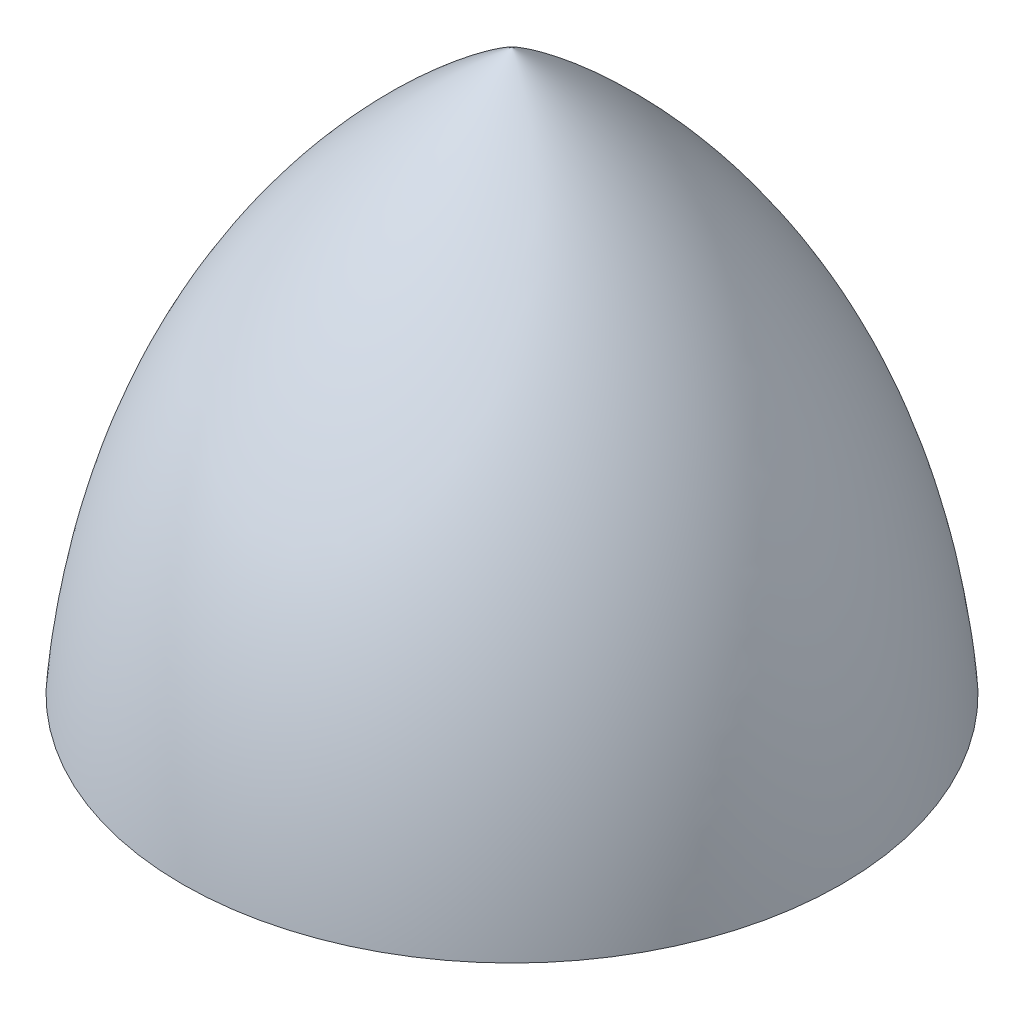
ISO-10303-21;
HEADER;
FILE_DESCRIPTION(('STEP AP214'),'2;1');
FILE_NAME('part.step','',(''),(''),'','','');
FILE_SCHEMA(('AUTOMOTIVE_DESIGN { 1 0 10303 214 1 1 1 1 }'));
ENDSEC;
DATA;
#1=APPLICATION_CONTEXT('core data for automotive mechanical design processes');
#2=APPLICATION_PROTOCOL_DEFINITION('international standard','automotive_design',2000,#1);
#3=PRODUCT_CONTEXT('',#1,'mechanical');
#4=PRODUCT('Part','Part','',(#3));
#5=PRODUCT_RELATED_PRODUCT_CATEGORY('part','',(#4));
#6=PRODUCT_DEFINITION_FORMATION('','',#4);
#7=PRODUCT_DEFINITION_CONTEXT('part definition',#1,'design');
#8=PRODUCT_DEFINITION('design','',#6,#7);
#9=PRODUCT_DEFINITION_SHAPE('','',#8);
#10=(LENGTH_UNIT() NAMED_UNIT(*) SI_UNIT(.MILLI.,.METRE.));
#11=(NAMED_UNIT(*) PLANE_ANGLE_UNIT() SI_UNIT($,.RADIAN.));
#12=(NAMED_UNIT(*) SI_UNIT($,.STERADIAN.) SOLID_ANGLE_UNIT());
#13=UNCERTAINTY_MEASURE_WITH_UNIT(LENGTH_MEASURE(1.E-05),#10,'distance_accuracy_value','');
#14=(GEOMETRIC_REPRESENTATION_CONTEXT(3) GLOBAL_UNCERTAINTY_ASSIGNED_CONTEXT((#13)) GLOBAL_UNIT_ASSIGNED_CONTEXT((#10,
#11,#12)) REPRESENTATION_CONTEXT('',''));
#15=CARTESIAN_POINT('',(0.,0.,0.));
#16=DIRECTION('',(0.,0.,1.));
#17=DIRECTION('',(1.,0.,0.));
#18=AXIS2_PLACEMENT_3D('',#15,#16,#17);
#19=CARTESIAN_POINT('',(0.,750.,0.));
#20=CARTESIAN_POINT('',(357.710489502766,458.385199362236,0.));
#21=CARTESIAN_POINT('',(400.,0.,0.));
#22=B_SPLINE_CURVE_WITH_KNOTS('',2,(#19,#20,#21),.UNSPECIFIED.,.F.,.F.,(3,3),(0.,1.),.UNSPECIFIED.);
#23=CARTESIAN_POINT('',(0.,286.878092341758,0.));
#24=DIRECTION('',(0.,1.,0.));
#25=AXIS1_PLACEMENT('',#23,#24);
#26=SURFACE_OF_REVOLUTION('',#22,#25);
#27=CARTESIAN_POINT('',(0.,0.,0.));
#28=DIRECTION('',(0.,1.,0.));
#29=DIRECTION('',(0.,0.,1.));
#30=AXIS2_PLACEMENT_3D('',#27,#28,#29);
#31=CIRCLE('',#30,400.);
#32=CARTESIAN_POINT('',(0.,0.,400.));
#33=VERTEX_POINT('',#32);
#34=EDGE_CURVE('E11',#33,#33,#31,.T.);
#35=ORIENTED_EDGE('',*,*,#34,.F.);
#36=EDGE_LOOP('',(#35));
#37=FACE_BOUND('',#36,.T.);
#38=CARTESIAN_POINT('',(0.,750.,0.));
#39=VERTEX_POINT('',#38);
#40=VERTEX_LOOP('',#39);
#41=FACE_BOUND('',#40,.T.);
#42=ADVANCED_FACE('F32',(#37,#41),#26,.T.);
#43=CARTESIAN_POINT('',(400.,0.,0.));
#44=DIRECTION('',(0.,1.,0.));
#45=DIRECTION('',(0.,0.,1.));
#46=AXIS2_PLACEMENT_3D('',#43,#44,#45);
#47=PLANE('',#46);
#48=CARTESIAN_POINT('',(0.,0.,0.));
#49=DIRECTION('',(0.,1.,0.));
#50=DIRECTION('',(0.,0.,1.));
#51=AXIS2_PLACEMENT_3D('',#48,#49,#50);
#52=CIRCLE('',#51,500.);
#53=CARTESIAN_POINT('',(0.,0.,500.));
#54=VERTEX_POINT('',#53);
#55=EDGE_CURVE('E40',#54,#54,#52,.T.);
#56=ORIENTED_EDGE('',*,*,#55,.F.);
#57=EDGE_LOOP('',(#56));
#58=FACE_BOUND('',#57,.T.);
#59=ORIENTED_EDGE('',*,*,#34,.T.);
#60=EDGE_LOOP('',(#59));
#61=FACE_BOUND('',#60,.T.);
#62=ADVANCED_FACE('F49',(#58,#61),#47,.F.);
#63=CARTESIAN_POINT('',(500.,0.,0.));
#64=CARTESIAN_POINT('',(452.228611773193,543.916759888082,0.));
#65=CARTESIAN_POINT('',(0.,850.,0.));
#66=B_SPLINE_CURVE_WITH_KNOTS('',2,(#63,#64,#65),.UNSPECIFIED.,.F.,.F.,(3,3),(0.,1.),.UNSPECIFIED.);
#67=CARTESIAN_POINT('',(0.,286.878092341758,0.));
#68=DIRECTION('',(0.,1.,0.));
#69=AXIS1_PLACEMENT('',#67,#68);
#70=SURFACE_OF_REVOLUTION('',#66,#69);
#71=CARTESIAN_POINT('',(0.,850.,0.));
#72=VERTEX_POINT('',#71);
#73=VERTEX_LOOP('',#72);
#74=FACE_BOUND('',#73,.T.);
#75=ORIENTED_EDGE('',*,*,#55,.T.);
#76=EDGE_LOOP('',(#75));
#77=FACE_BOUND('',#76,.T.);
#78=ADVANCED_FACE('F46',(#74,#77),#70,.T.);
#79=CLOSED_SHELL('',(#42,#62,#78));
#80=MANIFOLD_SOLID_BREP('B2',#79);
#81=ADVANCED_BREP_SHAPE_REPRESENTATION('',(#18,#80),#14);
#82=SHAPE_DEFINITION_REPRESENTATION(#9,#81);
ENDSEC;
END-ISO-10303-21;
